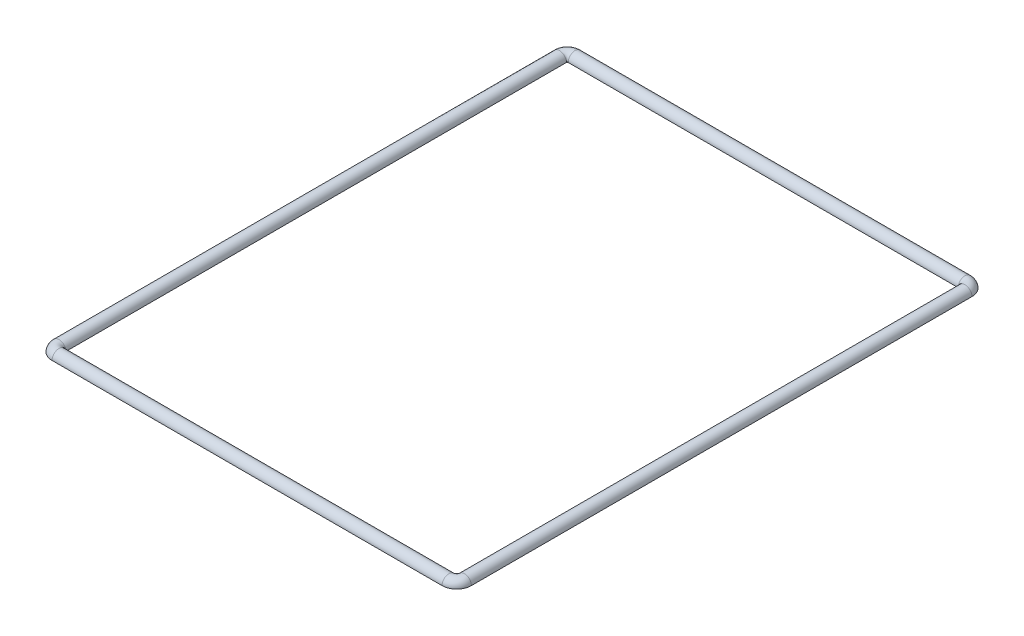
ISO-10303-21;
HEADER;
FILE_DESCRIPTION(('STEP AP214'),'2;1');
FILE_NAME('part.step','',(''),(''),'','','');
FILE_SCHEMA(('AUTOMOTIVE_DESIGN { 1 0 10303 214 1 1 1 1 }'));
ENDSEC;
DATA;
#1=APPLICATION_CONTEXT('core data for automotive mechanical design processes');
#2=APPLICATION_PROTOCOL_DEFINITION('international standard','automotive_design',2000,#1);
#3=PRODUCT_CONTEXT('',#1,'mechanical');
#4=PRODUCT('Part','Part','',(#3));
#5=PRODUCT_RELATED_PRODUCT_CATEGORY('part','',(#4));
#6=PRODUCT_DEFINITION_FORMATION('','',#4);
#7=PRODUCT_DEFINITION_CONTEXT('part definition',#1,'design');
#8=PRODUCT_DEFINITION('design','',#6,#7);
#9=PRODUCT_DEFINITION_SHAPE('','',#8);
#10=(LENGTH_UNIT() NAMED_UNIT(*) SI_UNIT(.MILLI.,.METRE.));
#11=(NAMED_UNIT(*) PLANE_ANGLE_UNIT() SI_UNIT($,.RADIAN.));
#12=(NAMED_UNIT(*) SI_UNIT($,.STERADIAN.) SOLID_ANGLE_UNIT());
#13=UNCERTAINTY_MEASURE_WITH_UNIT(LENGTH_MEASURE(1.E-05),#10,'distance_accuracy_value','');
#14=(GEOMETRIC_REPRESENTATION_CONTEXT(3) GLOBAL_UNCERTAINTY_ASSIGNED_CONTEXT((#13)) GLOBAL_UNIT_ASSIGNED_CONTEXT((#10,
#11,#12)) REPRESENTATION_CONTEXT('',''));
#15=CARTESIAN_POINT('',(0.,0.,0.));
#16=DIRECTION('',(0.,0.,1.));
#17=DIRECTION('',(1.,0.,0.));
#18=AXIS2_PLACEMENT_3D('',#15,#16,#17);
#19=CARTESIAN_POINT('',(7.14375000000006,0.,229.97795));
#20=DIRECTION('',(0.,1.,0.));
#21=DIRECTION('',(0.,0.,1.));
#22=AXIS2_PLACEMENT_3D('',#19,#20,#21);
#23=TOROIDAL_SURFACE('',#22,7.14375000000006,6.35);
#24=CARTESIAN_POINT('',(7.14375000000006,0.,237.1217));
#25=DIRECTION('',(1.,0.,0.));
#26=DIRECTION('',(0.,0.,-1.));
#27=AXIS2_PLACEMENT_3D('',#24,#25,#26);
#28=CIRCLE('',#27,6.34999999999999);
#29=CARTESIAN_POINT('',(7.14375000000006,0.,230.7717));
#30=VERTEX_POINT('',#29);
#31=CARTESIAN_POINT('',(7.14375000000006,0.,243.4717));
#32=VERTEX_POINT('',#31);
#33=EDGE_CURVE('E190',#30,#32,#28,.T.);
#34=ORIENTED_EDGE('',*,*,#33,.F.);
#35=CARTESIAN_POINT('',(7.14375000000006,0.,229.97795));
#36=DIRECTION('',(0.,1.,0.));
#37=DIRECTION('',(0.,0.,1.));
#38=AXIS2_PLACEMENT_3D('',#35,#36,#37);
#39=CIRCLE('',#38,0.793750000000065);
#40=CARTESIAN_POINT('',(6.35,0.,229.97795));
#41=VERTEX_POINT('',#40);
#42=EDGE_CURVE('E168',#30,#41,#39,.F.);
#43=ORIENTED_EDGE('',*,*,#42,.T.);
#44=CARTESIAN_POINT('',(0.,0.,229.97795));
#45=DIRECTION('',(0.,0.,-1.));
#46=DIRECTION('',(-1.,0.,0.));
#47=AXIS2_PLACEMENT_3D('',#44,#45,#46);
#48=CIRCLE('',#47,6.35);
#49=CARTESIAN_POINT('',(-6.34999999999998,0.,229.97795));
#50=VERTEX_POINT('',#49);
#51=EDGE_CURVE('E103',#50,#41,#48,.T.);
#52=ORIENTED_EDGE('',*,*,#51,.F.);
#53=CARTESIAN_POINT('',(7.14375000000006,0.,229.97795));
#54=DIRECTION('',(0.,1.,0.));
#55=DIRECTION('',(0.,0.,1.));
#56=AXIS2_PLACEMENT_3D('',#53,#54,#55);
#57=CIRCLE('',#56,13.4937500000001);
#58=EDGE_CURVE('E164',#50,#32,#57,.T.);
#59=ORIENTED_EDGE('',*,*,#58,.T.);
#60=EDGE_LOOP('',(#34,#43,#52,#59));
#61=FACE_BOUND('',#60,.T.);
#62=ADVANCED_FACE('F17',(#61),#23,.T.);
#63=CARTESIAN_POINT('',(7.14375000000006,0.,237.1217));
#64=DIRECTION('',(1.,0.,0.));
#65=DIRECTION('',(0.,0.,-1.));
#66=AXIS2_PLACEMENT_3D('',#63,#64,#65);
#67=CYLINDRICAL_SURFACE('',#66,6.34999999999999);
#68=CARTESIAN_POINT('',(365.49965,0.,237.1217));
#69=DIRECTION('',(1.,0.,0.));
#70=DIRECTION('',(0.,0.,1.));
#71=AXIS2_PLACEMENT_3D('',#68,#69,#70);
#72=CIRCLE('',#71,6.35);
#73=CARTESIAN_POINT('',(365.49965,0.,230.7717));
#74=VERTEX_POINT('',#73);
#75=CARTESIAN_POINT('',(365.49965,0.,243.4717));
#76=VERTEX_POINT('',#75);
#77=EDGE_CURVE('E131',#74,#76,#72,.T.);
#78=ORIENTED_EDGE('',*,*,#77,.F.);
#79=DIRECTION('',(1.,0.,0.));
#80=VECTOR('',#79,1.);
#81=CARTESIAN_POINT('',(-6.35,0.,230.7717));
#82=LINE('',#81,#80);
#83=EDGE_CURVE('E171',#74,#30,#82,.F.);
#84=ORIENTED_EDGE('',*,*,#83,.T.);
#85=ORIENTED_EDGE('',*,*,#33,.T.);
#86=DIRECTION('',(1.,0.,0.));
#87=VECTOR('',#86,1.);
#88=CARTESIAN_POINT('',(-6.35,0.,243.4717));
#89=LINE('',#88,#87);
#90=EDGE_CURVE('E163',#32,#76,#89,.T.);
#91=ORIENTED_EDGE('',*,*,#90,.T.);
#92=EDGE_LOOP('',(#78,#84,#85,#91));
#93=FACE_BOUND('',#92,.T.);
#94=ADVANCED_FACE('F137',(#93),#67,.T.);
#95=CARTESIAN_POINT('',(365.49965,0.,229.97795));
#96=DIRECTION('',(0.,1.,0.));
#97=DIRECTION('',(0.,0.,1.));
#98=AXIS2_PLACEMENT_3D('',#95,#96,#97);
#99=TOROIDAL_SURFACE('',#98,7.14375,6.35);
#100=CARTESIAN_POINT('',(372.6434,0.,229.97795));
#101=DIRECTION('',(0.,0.,-1.));
#102=DIRECTION('',(-1.,0.,0.));
#103=AXIS2_PLACEMENT_3D('',#100,#101,#102);
#104=CIRCLE('',#103,6.35000000000002);
#105=CARTESIAN_POINT('',(366.2934,0.,229.97795));
#106=VERTEX_POINT('',#105);
#107=CARTESIAN_POINT('',(378.9934,0.,229.97795));
#108=VERTEX_POINT('',#107);
#109=EDGE_CURVE('E129',#106,#108,#104,.T.);
#110=ORIENTED_EDGE('',*,*,#109,.F.);
#111=CARTESIAN_POINT('',(365.49965,0.,229.97795));
#112=DIRECTION('',(0.,1.,0.));
#113=DIRECTION('',(0.,0.,1.));
#114=AXIS2_PLACEMENT_3D('',#111,#112,#113);
#115=CIRCLE('',#114,0.793749999999982);
#116=EDGE_CURVE('E172',#106,#74,#115,.F.);
#117=ORIENTED_EDGE('',*,*,#116,.T.);
#118=ORIENTED_EDGE('',*,*,#77,.T.);
#119=CARTESIAN_POINT('',(365.49965,0.,229.97795));
#120=DIRECTION('',(0.,1.,0.));
#121=DIRECTION('',(0.,0.,1.));
#122=AXIS2_PLACEMENT_3D('',#119,#120,#121);
#123=CIRCLE('',#122,13.49375);
#124=EDGE_CURVE('E160',#76,#108,#123,.T.);
#125=ORIENTED_EDGE('',*,*,#124,.T.);
#126=EDGE_LOOP('',(#110,#117,#118,#125));
#127=FACE_BOUND('',#126,.T.);
#128=ADVANCED_FACE('F135',(#127),#99,.T.);
#129=CARTESIAN_POINT('',(372.6434,0.,229.97795));
#130=DIRECTION('',(0.,0.,-1.));
#131=DIRECTION('',(-1.,0.,0.));
#132=AXIS2_PLACEMENT_3D('',#129,#130,#131);
#133=CYLINDRICAL_SURFACE('',#132,6.35000000000002);
#134=CARTESIAN_POINT('',(372.6434,0.,-229.97795));
#135=DIRECTION('',(0.,0.,-1.));
#136=DIRECTION('',(1.,0.,0.));
#137=AXIS2_PLACEMENT_3D('',#134,#135,#136);
#138=CIRCLE('',#137,6.35);
#139=CARTESIAN_POINT('',(366.2934,0.,-229.97795));
#140=VERTEX_POINT('',#139);
#141=CARTESIAN_POINT('',(378.9934,0.,-229.97795));
#142=VERTEX_POINT('',#141);
#143=EDGE_CURVE('E127',#140,#142,#138,.T.);
#144=ORIENTED_EDGE('',*,*,#143,.F.);
#145=DIRECTION('',(0.,0.,1.));
#146=VECTOR('',#145,1.);
#147=CARTESIAN_POINT('',(366.2934,0.,229.97795));
#148=LINE('',#147,#146);
#149=EDGE_CURVE('E174',#140,#106,#148,.T.);
#150=ORIENTED_EDGE('',*,*,#149,.T.);
#151=ORIENTED_EDGE('',*,*,#109,.T.);
#152=DIRECTION('',(0.,0.,1.));
#153=VECTOR('',#152,1.);
#154=CARTESIAN_POINT('',(378.9934,0.,229.97795));
#155=LINE('',#154,#153);
#156=EDGE_CURVE('E159',#108,#142,#155,.F.);
#157=ORIENTED_EDGE('',*,*,#156,.T.);
#158=EDGE_LOOP('',(#144,#150,#151,#157));
#159=FACE_BOUND('',#158,.T.);
#160=ADVANCED_FACE('F122',(#159),#133,.T.);
#161=CARTESIAN_POINT('',(365.49965,0.,-229.97795));
#162=DIRECTION('',(0.,1.,0.));
#163=DIRECTION('',(0.,0.,1.));
#164=AXIS2_PLACEMENT_3D('',#161,#162,#163);
#165=TOROIDAL_SURFACE('',#164,7.14375000000006,6.35);
#166=CARTESIAN_POINT('',(365.49965,0.,-237.1217));
#167=DIRECTION('',(-1.,0.,0.));
#168=DIRECTION('',(0.,0.,1.));
#169=AXIS2_PLACEMENT_3D('',#166,#167,#168);
#170=CIRCLE('',#169,6.34999999999999);
#171=CARTESIAN_POINT('',(365.49965,0.,-230.7717));
#172=VERTEX_POINT('',#171);
#173=CARTESIAN_POINT('',(365.49965,0.,-243.4717));
#174=VERTEX_POINT('',#173);
#175=EDGE_CURVE('E93',#172,#174,#170,.T.);
#176=ORIENTED_EDGE('',*,*,#175,.F.);
#177=CARTESIAN_POINT('',(365.49965,0.,-229.97795));
#178=DIRECTION('',(0.,1.,0.));
#179=DIRECTION('',(0.,0.,1.));
#180=AXIS2_PLACEMENT_3D('',#177,#178,#179);
#181=CIRCLE('',#180,0.793750000000065);
#182=EDGE_CURVE('E100',#172,#140,#181,.F.);
#183=ORIENTED_EDGE('',*,*,#182,.T.);
#184=ORIENTED_EDGE('',*,*,#143,.T.);
#185=CARTESIAN_POINT('',(365.49965,0.,-229.97795));
#186=DIRECTION('',(0.,1.,0.));
#187=DIRECTION('',(0.,0.,1.));
#188=AXIS2_PLACEMENT_3D('',#185,#186,#187);
#189=CIRCLE('',#188,13.49375);
#190=EDGE_CURVE('E154',#142,#174,#189,.T.);
#191=ORIENTED_EDGE('',*,*,#190,.T.);
#192=EDGE_LOOP('',(#176,#183,#184,#191));
#193=FACE_BOUND('',#192,.T.);
#194=ADVANCED_FACE('F118',(#193),#165,.T.);
#195=CARTESIAN_POINT('',(365.49965,0.,-237.1217));
#196=DIRECTION('',(-1.,0.,0.));
#197=DIRECTION('',(0.,0.,1.));
#198=AXIS2_PLACEMENT_3D('',#195,#196,#197);
#199=CYLINDRICAL_SURFACE('',#198,6.34999999999999);
#200=CARTESIAN_POINT('',(7.14375000000059,0.,-237.1217));
#201=DIRECTION('',(-1.,0.,0.));
#202=DIRECTION('',(0.,0.,-1.));
#203=AXIS2_PLACEMENT_3D('',#200,#201,#202);
#204=CIRCLE('',#203,6.35);
#205=CARTESIAN_POINT('',(7.14375000000009,0.,-230.7717));
#206=VERTEX_POINT('',#205);
#207=CARTESIAN_POINT('',(7.14375000000056,0.,-243.4717));
#208=VERTEX_POINT('',#207);
#209=EDGE_CURVE('E85',#206,#208,#204,.T.);
#210=ORIENTED_EDGE('',*,*,#209,.F.);
#211=DIRECTION('',(1.,0.,0.));
#212=VECTOR('',#211,1.);
#213=CARTESIAN_POINT('',(-6.35,0.,-230.7717));
#214=LINE('',#213,#212);
#215=EDGE_CURVE('E87',#206,#172,#214,.T.);
#216=ORIENTED_EDGE('',*,*,#215,.T.);
#217=ORIENTED_EDGE('',*,*,#175,.T.);
#218=DIRECTION('',(1.,0.,0.));
#219=VECTOR('',#218,1.);
#220=CARTESIAN_POINT('',(-6.35,0.,-243.4717));
#221=LINE('',#220,#219);
#222=EDGE_CURVE('E89',#174,#208,#221,.F.);
#223=ORIENTED_EDGE('',*,*,#222,.T.);
#224=EDGE_LOOP('',(#210,#216,#217,#223));
#225=FACE_BOUND('',#224,.T.);
#226=ADVANCED_FACE('F86',(#225),#199,.T.);
#227=CARTESIAN_POINT('',(7.14375000000006,0.,-229.97795));
#228=DIRECTION('',(0.,1.,0.));
#229=DIRECTION('',(0.,0.,1.));
#230=AXIS2_PLACEMENT_3D('',#227,#228,#229);
#231=TOROIDAL_SURFACE('',#230,7.14375,6.35);
#232=CARTESIAN_POINT('',(0.,0.,-229.97795));
#233=DIRECTION('',(0.,0.,-1.));
#234=DIRECTION('',(-1.,0.,0.));
#235=AXIS2_PLACEMENT_3D('',#232,#233,#234);
#236=CIRCLE('',#235,6.35);
#237=CARTESIAN_POINT('',(6.35000000000001,0.,-229.97795));
#238=VERTEX_POINT('',#237);
#239=CARTESIAN_POINT('',(-6.34999999999997,0.,-229.97795));
#240=VERTEX_POINT('',#239);
#241=EDGE_CURVE('E35',#238,#240,#236,.F.);
#242=ORIENTED_EDGE('',*,*,#241,.F.);
#243=CARTESIAN_POINT('',(7.14375000000006,0.,-229.97795));
#244=DIRECTION('',(0.,1.,0.));
#245=DIRECTION('',(0.,0.,1.));
#246=AXIS2_PLACEMENT_3D('',#243,#244,#245);
#247=CIRCLE('',#246,0.79375000000001);
#248=EDGE_CURVE('E21',#238,#206,#247,.F.);
#249=ORIENTED_EDGE('',*,*,#248,.T.);
#250=ORIENTED_EDGE('',*,*,#209,.T.);
#251=CARTESIAN_POINT('',(7.14375000000006,0.,-229.97795));
#252=DIRECTION('',(0.,1.,0.));
#253=DIRECTION('',(0.,0.,1.));
#254=AXIS2_PLACEMENT_3D('',#251,#252,#253);
#255=CIRCLE('',#254,13.49375);
#256=EDGE_CURVE('E27',#208,#240,#255,.T.);
#257=ORIENTED_EDGE('',*,*,#256,.T.);
#258=EDGE_LOOP('',(#242,#249,#250,#257));
#259=FACE_BOUND('',#258,.T.);
#260=ADVANCED_FACE('F102',(#259),#231,.T.);
#261=CARTESIAN_POINT('',(0.,0.,229.97795));
#262=DIRECTION('',(0.,0.,-1.));
#263=DIRECTION('',(-1.,0.,0.));
#264=AXIS2_PLACEMENT_3D('',#261,#262,#263);
#265=CYLINDRICAL_SURFACE('',#264,6.35);
#266=DIRECTION('',(0.,0.,1.));
#267=VECTOR('',#266,1.);
#268=CARTESIAN_POINT('',(-6.34999999999997,0.,229.97795));
#269=LINE('',#268,#267);
#270=EDGE_CURVE('E11',#240,#50,#269,.T.);
#271=ORIENTED_EDGE('',*,*,#270,.T.);
#272=ORIENTED_EDGE('',*,*,#51,.T.);
#273=DIRECTION('',(0.,0.,1.));
#274=VECTOR('',#273,1.);
#275=CARTESIAN_POINT('',(6.35,0.,229.97795));
#276=LINE('',#275,#274);
#277=EDGE_CURVE('E167',#41,#238,#276,.F.);
#278=ORIENTED_EDGE('',*,*,#277,.T.);
#279=ORIENTED_EDGE('',*,*,#241,.T.);
#280=EDGE_LOOP('',(#271,#272,#278,#279));
#281=FACE_BOUND('',#280,.T.);
#282=ADVANCED_FACE('F114',(#281),#265,.T.);
#283=CARTESIAN_POINT('',(-6.35,0.,229.97795));
#284=DIRECTION('',(0.,1.,0.));
#285=DIRECTION('',(0.,0.,1.));
#286=AXIS2_PLACEMENT_3D('',#283,#284,#285);
#287=PLANE('',#286);
#288=ORIENTED_EDGE('',*,*,#256,.F.);
#289=ORIENTED_EDGE('',*,*,#222,.F.);
#290=ORIENTED_EDGE('',*,*,#190,.F.);
#291=ORIENTED_EDGE('',*,*,#156,.F.);
#292=ORIENTED_EDGE('',*,*,#124,.F.);
#293=ORIENTED_EDGE('',*,*,#90,.F.);
#294=ORIENTED_EDGE('',*,*,#58,.F.);
#295=ORIENTED_EDGE('',*,*,#270,.F.);
#296=EDGE_LOOP('',(#288,#289,#290,#291,#292,#293,#294,#295));
#297=FACE_BOUND('',#296,.T.);
#298=ORIENTED_EDGE('',*,*,#42,.F.);
#299=ORIENTED_EDGE('',*,*,#83,.F.);
#300=ORIENTED_EDGE('',*,*,#116,.F.);
#301=ORIENTED_EDGE('',*,*,#149,.F.);
#302=ORIENTED_EDGE('',*,*,#182,.F.);
#303=ORIENTED_EDGE('',*,*,#215,.F.);
#304=ORIENTED_EDGE('',*,*,#248,.F.);
#305=ORIENTED_EDGE('',*,*,#277,.F.);
#306=EDGE_LOOP('',(#298,#299,#300,#301,#302,#303,#304,#305));
#307=FACE_BOUND('',#306,.T.);
#308=ADVANCED_FACE('F97',(#297,#307),#287,.F.);
#309=CLOSED_SHELL('',(#62,#94,#128,#160,#194,#226,#260,#282,#308));
#310=MANIFOLD_SOLID_BREP('B1',#309);
#311=ADVANCED_BREP_SHAPE_REPRESENTATION('',(#18,#310),#14);
#312=SHAPE_DEFINITION_REPRESENTATION(#9,#311);
ENDSEC;
END-ISO-10303-21;
